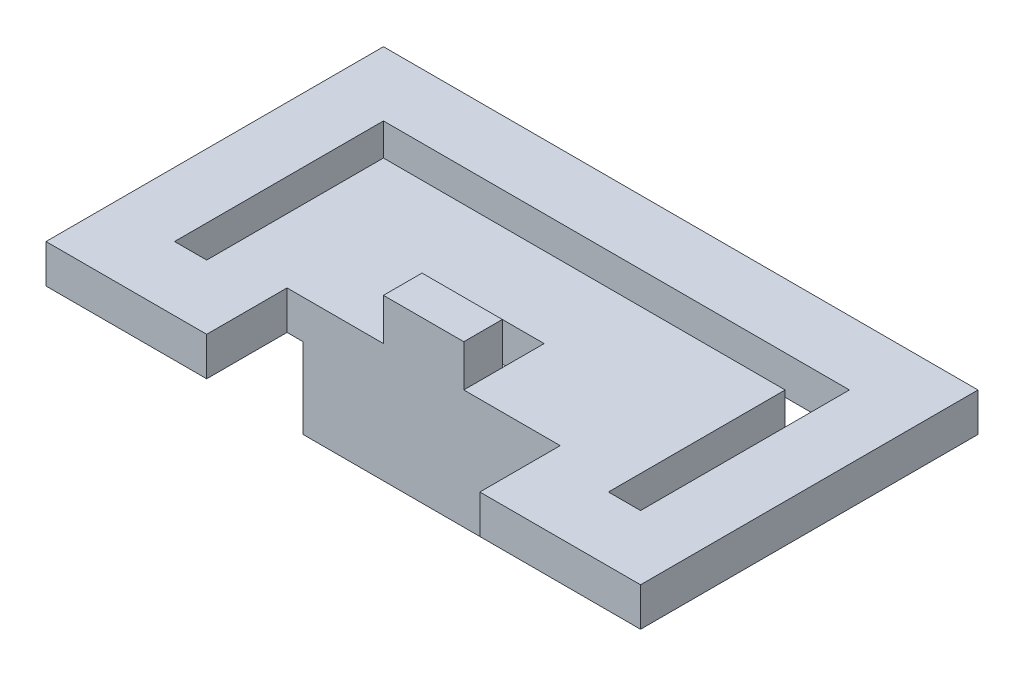
ISO-10303-21;
HEADER;
FILE_DESCRIPTION(('STEP AP214'),'2;1');
FILE_NAME('part.step','',(''),(''),'','','');
FILE_SCHEMA(('AUTOMOTIVE_DESIGN { 1 0 10303 214 1 1 1 1 }'));
ENDSEC;
DATA;
#1=APPLICATION_CONTEXT('core data for automotive mechanical design processes');
#2=APPLICATION_PROTOCOL_DEFINITION('international standard','automotive_design',2000,#1);
#3=PRODUCT_CONTEXT('',#1,'mechanical');
#4=PRODUCT('Part','Part','',(#3));
#5=PRODUCT_RELATED_PRODUCT_CATEGORY('part','',(#4));
#6=PRODUCT_DEFINITION_FORMATION('','',#4);
#7=PRODUCT_DEFINITION_CONTEXT('part definition',#1,'design');
#8=PRODUCT_DEFINITION('design','',#6,#7);
#9=PRODUCT_DEFINITION_SHAPE('','',#8);
#10=(LENGTH_UNIT() NAMED_UNIT(*) SI_UNIT(.MILLI.,.METRE.));
#11=(NAMED_UNIT(*) PLANE_ANGLE_UNIT() SI_UNIT($,.RADIAN.));
#12=(NAMED_UNIT(*) SI_UNIT($,.STERADIAN.) SOLID_ANGLE_UNIT());
#13=UNCERTAINTY_MEASURE_WITH_UNIT(LENGTH_MEASURE(1.E-05),#10,'distance_accuracy_value','');
#14=(GEOMETRIC_REPRESENTATION_CONTEXT(3) GLOBAL_UNCERTAINTY_ASSIGNED_CONTEXT((#13)) GLOBAL_UNIT_ASSIGNED_CONTEXT((#10,
#11,#12)) REPRESENTATION_CONTEXT('',''));
#15=CARTESIAN_POINT('',(0.,0.,0.));
#16=DIRECTION('',(0.,0.,1.));
#17=DIRECTION('',(1.,0.,0.));
#18=AXIS2_PLACEMENT_3D('',#15,#16,#17);
#19=CARTESIAN_POINT('',(1.5,0.,0.24));
#20=DIRECTION('',(0.,1.,0.));
#21=DIRECTION('',(0.,0.,1.));
#22=AXIS2_PLACEMENT_3D('',#19,#20,#21);
#23=PLANE('',#22);
#24=DIRECTION('',(1.,0.,0.));
#25=VECTOR('',#24,1.);
#26=CARTESIAN_POINT('',(1.5,0.,0.));
#27=LINE('',#26,#25);
#28=CARTESIAN_POINT('',(0.,0.,0.));
#29=VERTEX_POINT('',#28);
#30=CARTESIAN_POINT('',(1.5,0.,0.));
#31=VERTEX_POINT('',#30);
#32=EDGE_CURVE('E438',#29,#31,#27,.T.);
#33=ORIENTED_EDGE('',*,*,#32,.T.);
#34=DIRECTION('',(0.,0.,-1.));
#35=VECTOR('',#34,1.);
#36=CARTESIAN_POINT('',(1.5,0.,0.24));
#37=LINE('',#36,#35);
#38=CARTESIAN_POINT('',(1.5,0.,0.24));
#39=VERTEX_POINT('',#38);
#40=EDGE_CURVE('E11',#39,#31,#37,.T.);
#41=ORIENTED_EDGE('',*,*,#40,.F.);
#42=DIRECTION('',(1.,0.,0.));
#43=VECTOR('',#42,1.);
#44=CARTESIAN_POINT('',(1.5,0.,0.24));
#45=LINE('',#44,#43);
#46=CARTESIAN_POINT('',(0.,0.,0.24));
#47=VERTEX_POINT('',#46);
#48=EDGE_CURVE('E439',#47,#39,#45,.T.);
#49=ORIENTED_EDGE('',*,*,#48,.F.);
#50=DIRECTION('',(0.,0.,-1.));
#51=VECTOR('',#50,1.);
#52=CARTESIAN_POINT('',(0.,0.,0.24));
#53=LINE('',#52,#51);
#54=EDGE_CURVE('E460',#47,#29,#53,.T.);
#55=ORIENTED_EDGE('',*,*,#54,.T.);
#56=EDGE_LOOP('',(#33,#41,#49,#55));
#57=FACE_BOUND('',#56,.T.);
#58=ADVANCED_FACE('F39',(#57),#23,.F.);
#59=CARTESIAN_POINT('',(1.5,0.5,0.24));
#60=DIRECTION('',(-1.,0.,0.));
#61=DIRECTION('',(0.,0.,1.));
#62=AXIS2_PLACEMENT_3D('',#59,#60,#61);
#63=PLANE('',#62);
#64=DIRECTION('',(0.,1.,0.));
#65=VECTOR('',#64,1.);
#66=CARTESIAN_POINT('',(1.5,0.5,0.));
#67=LINE('',#66,#65);
#68=CARTESIAN_POINT('',(1.5,0.5,0.));
#69=VERTEX_POINT('',#68);
#70=EDGE_CURVE('E464',#31,#69,#67,.T.);
#71=ORIENTED_EDGE('',*,*,#70,.T.);
#72=DIRECTION('',(0.,0.,-1.));
#73=VECTOR('',#72,1.);
#74=CARTESIAN_POINT('',(1.5,0.5,0.24));
#75=LINE('',#74,#73);
#76=CARTESIAN_POINT('',(1.5,0.5,0.24));
#77=VERTEX_POINT('',#76);
#78=EDGE_CURVE('E47',#77,#69,#75,.T.);
#79=ORIENTED_EDGE('',*,*,#78,.F.);
#80=DIRECTION('',(0.,1.,0.));
#81=VECTOR('',#80,1.);
#82=CARTESIAN_POINT('',(1.5,0.5,0.24));
#83=LINE('',#82,#81);
#84=EDGE_CURVE('E443',#39,#77,#83,.T.);
#85=ORIENTED_EDGE('',*,*,#84,.F.);
#86=ORIENTED_EDGE('',*,*,#40,.T.);
#87=EDGE_LOOP('',(#71,#79,#85,#86));
#88=FACE_BOUND('',#87,.T.);
#89=ADVANCED_FACE('F514',(#88),#63,.F.);
#90=CARTESIAN_POINT('',(1.,1.,0.24));
#91=DIRECTION('',(-1.,0.,0.));
#92=DIRECTION('',(0.,0.,1.));
#93=AXIS2_PLACEMENT_3D('',#90,#91,#92);
#94=PLANE('',#93);
#95=DIRECTION('',(0.,1.,0.));
#96=VECTOR('',#95,1.);
#97=CARTESIAN_POINT('',(1.,1.,0.24));
#98=LINE('',#97,#96);
#99=CARTESIAN_POINT('',(1.,0.74,0.24));
#100=VERTEX_POINT('',#99);
#101=CARTESIAN_POINT('',(1.,1.,0.24));
#102=VERTEX_POINT('',#101);
#103=EDGE_CURVE('E447',#100,#102,#98,.T.);
#104=ORIENTED_EDGE('',*,*,#103,.F.);
#105=DIRECTION('',(0.,0.,1.));
#106=VECTOR('',#105,1.);
#107=CARTESIAN_POINT('',(1.,0.74,-0.26));
#108=LINE('',#107,#106);
#109=CARTESIAN_POINT('',(1.,0.74,0.));
#110=VERTEX_POINT('',#109);
#111=EDGE_CURVE('E385',#110,#100,#108,.T.);
#112=ORIENTED_EDGE('',*,*,#111,.F.);
#113=DIRECTION('',(0.,1.,0.));
#114=VECTOR('',#113,1.);
#115=CARTESIAN_POINT('',(1.,1.,0.));
#116=LINE('',#115,#114);
#117=CARTESIAN_POINT('',(1.,1.,0.));
#118=VERTEX_POINT('',#117);
#119=EDGE_CURVE('E471',#110,#118,#116,.T.);
#120=ORIENTED_EDGE('',*,*,#119,.T.);
#121=DIRECTION('',(0.,0.,-1.));
#122=VECTOR('',#121,1.);
#123=CARTESIAN_POINT('',(1.,1.,0.24));
#124=LINE('',#123,#122);
#125=EDGE_CURVE('E501',#102,#118,#124,.T.);
#126=ORIENTED_EDGE('',*,*,#125,.F.);
#127=EDGE_LOOP('',(#104,#112,#120,#126));
#128=FACE_BOUND('',#127,.T.);
#129=ADVANCED_FACE('F547',(#128),#94,.F.);
#130=CARTESIAN_POINT('',(0.5,1.,0.24));
#131=DIRECTION('',(0.,-1.,0.));
#132=DIRECTION('',(0.,0.,-1.));
#133=AXIS2_PLACEMENT_3D('',#130,#131,#132);
#134=PLANE('',#133);
#135=DIRECTION('',(-1.,0.,0.));
#136=VECTOR('',#135,1.);
#137=CARTESIAN_POINT('',(0.5,1.,0.));
#138=LINE('',#137,#136);
#139=CARTESIAN_POINT('',(0.5,1.,0.));
#140=VERTEX_POINT('',#139);
#141=EDGE_CURVE('E476',#118,#140,#138,.T.);
#142=ORIENTED_EDGE('',*,*,#141,.T.);
#143=DIRECTION('',(0.,0.,-1.));
#144=VECTOR('',#143,1.);
#145=CARTESIAN_POINT('',(0.5,1.,0.24));
#146=LINE('',#145,#144);
#147=CARTESIAN_POINT('',(0.5,1.,0.24));
#148=VERTEX_POINT('',#147);
#149=EDGE_CURVE('E497',#148,#140,#146,.T.);
#150=ORIENTED_EDGE('',*,*,#149,.F.);
#151=DIRECTION('',(-1.,0.,0.));
#152=VECTOR('',#151,1.);
#153=CARTESIAN_POINT('',(0.5,1.,0.24));
#154=LINE('',#153,#152);
#155=EDGE_CURVE('E450',#102,#148,#154,.T.);
#156=ORIENTED_EDGE('',*,*,#155,.F.);
#157=ORIENTED_EDGE('',*,*,#125,.T.);
#158=EDGE_LOOP('',(#142,#150,#156,#157));
#159=FACE_BOUND('',#158,.T.);
#160=ADVANCED_FACE('F550',(#159),#134,.F.);
#161=CARTESIAN_POINT('',(0.5,0.5,0.24));
#162=DIRECTION('',(1.,0.,0.));
#163=DIRECTION('',(0.,0.,-1.));
#164=AXIS2_PLACEMENT_3D('',#161,#162,#163);
#165=PLANE('',#164);
#166=DIRECTION('',(0.,-1.,0.));
#167=VECTOR('',#166,1.);
#168=CARTESIAN_POINT('',(0.5,0.5,0.));
#169=LINE('',#168,#167);
#170=CARTESIAN_POINT('',(0.5,0.74,0.));
#171=VERTEX_POINT('',#170);
#172=EDGE_CURVE('E480',#140,#171,#169,.T.);
#173=ORIENTED_EDGE('',*,*,#172,.T.);
#174=DIRECTION('',(0.,0.,-1.));
#175=VECTOR('',#174,1.);
#176=CARTESIAN_POINT('',(0.5,0.74,0.24));
#177=LINE('',#176,#175);
#178=CARTESIAN_POINT('',(0.5,0.74,0.24));
#179=VERTEX_POINT('',#178);
#180=EDGE_CURVE('E379',#179,#171,#177,.T.);
#181=ORIENTED_EDGE('',*,*,#180,.F.);
#182=DIRECTION('',(0.,-1.,0.));
#183=VECTOR('',#182,1.);
#184=CARTESIAN_POINT('',(0.5,0.5,0.24));
#185=LINE('',#184,#183);
#186=EDGE_CURVE('E453',#148,#179,#185,.T.);
#187=ORIENTED_EDGE('',*,*,#186,.F.);
#188=ORIENTED_EDGE('',*,*,#149,.T.);
#189=EDGE_LOOP('',(#173,#181,#187,#188));
#190=FACE_BOUND('',#189,.T.);
#191=ADVANCED_FACE('F553',(#190),#165,.F.);
#192=CARTESIAN_POINT('',(0.,0.,0.24));
#193=DIRECTION('',(1.,0.,0.));
#194=DIRECTION('',(0.,0.,-1.));
#195=AXIS2_PLACEMENT_3D('',#192,#193,#194);
#196=PLANE('',#195);
#197=DIRECTION('',(0.,-1.,0.));
#198=VECTOR('',#197,1.);
#199=CARTESIAN_POINT('',(0.,0.,0.));
#200=LINE('',#199,#198);
#201=CARTESIAN_POINT('',(0.,0.5,0.));
#202=VERTEX_POINT('',#201);
#203=EDGE_CURVE('E444',#202,#29,#200,.T.);
#204=ORIENTED_EDGE('',*,*,#203,.T.);
#205=ORIENTED_EDGE('',*,*,#54,.F.);
#206=DIRECTION('',(0.,-1.,0.));
#207=VECTOR('',#206,1.);
#208=CARTESIAN_POINT('',(0.,0.,0.24));
#209=LINE('',#208,#207);
#210=CARTESIAN_POINT('',(0.,0.5,0.24));
#211=VERTEX_POINT('',#210);
#212=EDGE_CURVE('E457',#211,#47,#209,.T.);
#213=ORIENTED_EDGE('',*,*,#212,.F.);
#214=DIRECTION('',(0.,0.,-1.));
#215=VECTOR('',#214,1.);
#216=CARTESIAN_POINT('',(0.,0.5,0.24));
#217=LINE('',#216,#215);
#218=EDGE_CURVE('E493',#211,#202,#217,.T.);
#219=ORIENTED_EDGE('',*,*,#218,.T.);
#220=EDGE_LOOP('',(#204,#205,#213,#219));
#221=FACE_BOUND('',#220,.T.);
#222=ADVANCED_FACE('F585',(#221),#196,.F.);
#223=CARTESIAN_POINT('',(0.,0.,0.24));
#224=DIRECTION('',(0.,0.,-1.));
#225=DIRECTION('',(-1.,0.,0.));
#226=AXIS2_PLACEMENT_3D('',#223,#224,#225);
#227=PLANE('',#226);
#228=DIRECTION('',(1.,0.,0.));
#229=VECTOR('',#228,1.);
#230=CARTESIAN_POINT('',(-0.5,0.74,0.24));
#231=LINE('',#230,#229);
#232=CARTESIAN_POINT('',(-0.1,0.74,0.24));
#233=VERTEX_POINT('',#232);
#234=EDGE_CURVE('E59',#233,#179,#231,.T.);
#235=ORIENTED_EDGE('',*,*,#234,.F.);
#236=DIRECTION('',(0.,1.,0.));
#237=VECTOR('',#236,1.);
#238=CARTESIAN_POINT('',(-0.1,0.5,0.24));
#239=LINE('',#238,#237);
#240=CARTESIAN_POINT('',(-0.1,0.5,0.24));
#241=VERTEX_POINT('',#240);
#242=EDGE_CURVE('E335',#241,#233,#239,.T.);
#243=ORIENTED_EDGE('',*,*,#242,.F.);
#244=DIRECTION('',(1.,0.,0.));
#245=VECTOR('',#244,1.);
#246=CARTESIAN_POINT('',(-0.5,0.5,0.24));
#247=LINE('',#246,#245);
#248=EDGE_CURVE('E338',#241,#211,#247,.T.);
#249=ORIENTED_EDGE('',*,*,#248,.T.);
#250=ORIENTED_EDGE('',*,*,#212,.T.);
#251=ORIENTED_EDGE('',*,*,#48,.T.);
#252=ORIENTED_EDGE('',*,*,#84,.T.);
#253=DIRECTION('',(1.,0.,0.));
#254=VECTOR('',#253,1.);
#255=CARTESIAN_POINT('',(1.,0.5,0.24));
#256=LINE('',#255,#254);
#257=CARTESIAN_POINT('',(1.6,0.5,0.24));
#258=VERTEX_POINT('',#257);
#259=EDGE_CURVE('E415',#77,#258,#256,.T.);
#260=ORIENTED_EDGE('',*,*,#259,.T.);
#261=DIRECTION('',(0.,1.,0.));
#262=VECTOR('',#261,1.);
#263=CARTESIAN_POINT('',(1.6,0.5,0.24));
#264=LINE('',#263,#262);
#265=CARTESIAN_POINT('',(1.6,0.74,0.24));
#266=VERTEX_POINT('',#265);
#267=EDGE_CURVE('E357',#258,#266,#264,.T.);
#268=ORIENTED_EDGE('',*,*,#267,.T.);
#269=DIRECTION('',(1.,0.,0.));
#270=VECTOR('',#269,1.);
#271=CARTESIAN_POINT('',(1.,0.74,0.24));
#272=LINE('',#271,#270);
#273=EDGE_CURVE('E390',#100,#266,#272,.T.);
#274=ORIENTED_EDGE('',*,*,#273,.F.);
#275=ORIENTED_EDGE('',*,*,#103,.T.);
#276=ORIENTED_EDGE('',*,*,#155,.T.);
#277=ORIENTED_EDGE('',*,*,#186,.T.);
#278=EDGE_LOOP('',(#235,#243,#249,#250,#251,#252,#260,#268,#274,#275,#276,#277));
#279=FACE_BOUND('',#278,.T.);
#280=ADVANCED_FACE('F556',(#279),#227,.F.);
#281=CARTESIAN_POINT('',(0.,0.,0.));
#282=DIRECTION('',(0.,0.,-1.));
#283=DIRECTION('',(-1.,0.,0.));
#284=AXIS2_PLACEMENT_3D('',#281,#282,#283);
#285=PLANE('',#284);
#286=ORIENTED_EDGE('',*,*,#32,.F.);
#287=ORIENTED_EDGE('',*,*,#203,.F.);
#288=DIRECTION('',(-1.,0.,0.));
#289=VECTOR('',#288,1.);
#290=CARTESIAN_POINT('',(0.,0.5,0.));
#291=LINE('',#290,#289);
#292=CARTESIAN_POINT('',(0.5,0.5,0.));
#293=VERTEX_POINT('',#292);
#294=EDGE_CURVE('E484',#293,#202,#291,.T.);
#295=ORIENTED_EDGE('',*,*,#294,.F.);
#296=EDGE_CURVE('E479',#171,#293,#169,.T.);
#297=ORIENTED_EDGE('',*,*,#296,.F.);
#298=ORIENTED_EDGE('',*,*,#172,.F.);
#299=ORIENTED_EDGE('',*,*,#141,.F.);
#300=ORIENTED_EDGE('',*,*,#119,.F.);
#301=CARTESIAN_POINT('',(1.,0.5,0.));
#302=VERTEX_POINT('',#301);
#303=EDGE_CURVE('E472',#302,#110,#116,.T.);
#304=ORIENTED_EDGE('',*,*,#303,.F.);
#305=DIRECTION('',(-1.,0.,0.));
#306=VECTOR('',#305,1.);
#307=CARTESIAN_POINT('',(1.,0.5,0.));
#308=LINE('',#307,#306);
#309=EDGE_CURVE('E467',#69,#302,#308,.T.);
#310=ORIENTED_EDGE('',*,*,#309,.F.);
#311=ORIENTED_EDGE('',*,*,#70,.F.);
#312=EDGE_LOOP('',(#286,#287,#295,#297,#298,#299,#300,#304,#310,#311));
#313=FACE_BOUND('',#312,.T.);
#314=ADVANCED_FACE('F518',(#313),#285,.T.);
#315=CARTESIAN_POINT('',(0.,0.5,0.));
#316=DIRECTION('',(0.,1.,0.));
#317=DIRECTION('',(0.,0.,1.));
#318=AXIS2_PLACEMENT_3D('',#315,#316,#317);
#319=PLANE('',#318);
#320=ORIENTED_EDGE('',*,*,#248,.F.);
#321=DIRECTION('',(0.,0.,-1.));
#322=VECTOR('',#321,1.);
#323=CARTESIAN_POINT('',(-0.1,0.5,0.24));
#324=LINE('',#323,#322);
#325=CARTESIAN_POINT('',(-0.0999999999999999,0.5,0.74));
#326=VERTEX_POINT('',#325);
#327=EDGE_CURVE('E242',#326,#241,#324,.T.);
#328=ORIENTED_EDGE('',*,*,#327,.F.);
#329=DIRECTION('',(1.,0.,0.));
#330=VECTOR('',#329,1.);
#331=CARTESIAN_POINT('',(-0.0999999999999999,0.5,0.74));
#332=LINE('',#331,#330);
#333=CARTESIAN_POINT('',(-1.1,0.5,0.74));
#334=VERTEX_POINT('',#333);
#335=EDGE_CURVE('E289',#334,#326,#332,.T.);
#336=ORIENTED_EDGE('',*,*,#335,.F.);
#337=DIRECTION('',(0.,0.,1.));
#338=VECTOR('',#337,1.);
#339=CARTESIAN_POINT('',(-1.1,0.5,0.74));
#340=LINE('',#339,#338);
#341=CARTESIAN_POINT('',(-1.1,0.5,-1.36));
#342=VERTEX_POINT('',#341);
#343=EDGE_CURVE('E285',#342,#334,#340,.T.);
#344=ORIENTED_EDGE('',*,*,#343,.F.);
#345=DIRECTION('',(-1.,0.,0.));
#346=VECTOR('',#345,1.);
#347=CARTESIAN_POINT('',(-1.1,0.5,-1.36));
#348=LINE('',#347,#346);
#349=CARTESIAN_POINT('',(2.6,0.5,-1.36));
#350=VERTEX_POINT('',#349);
#351=EDGE_CURVE('E281',#350,#342,#348,.T.);
#352=ORIENTED_EDGE('',*,*,#351,.F.);
#353=DIRECTION('',(0.,0.,-1.));
#354=VECTOR('',#353,1.);
#355=CARTESIAN_POINT('',(2.6,0.5,-1.36));
#356=LINE('',#355,#354);
#357=CARTESIAN_POINT('',(2.6,0.5,0.74));
#358=VERTEX_POINT('',#357);
#359=EDGE_CURVE('E277',#358,#350,#356,.T.);
#360=ORIENTED_EDGE('',*,*,#359,.F.);
#361=DIRECTION('',(1.,0.,0.));
#362=VECTOR('',#361,1.);
#363=CARTESIAN_POINT('',(2.6,0.5,0.74));
#364=LINE('',#363,#362);
#365=CARTESIAN_POINT('',(1.6,0.5,0.74));
#366=VERTEX_POINT('',#365);
#367=EDGE_CURVE('E273',#366,#358,#364,.T.);
#368=ORIENTED_EDGE('',*,*,#367,.F.);
#369=DIRECTION('',(0.,0.,1.));
#370=VECTOR('',#369,1.);
#371=CARTESIAN_POINT('',(1.6,0.5,0.74));
#372=LINE('',#371,#370);
#373=EDGE_CURVE('E269',#258,#366,#372,.T.);
#374=ORIENTED_EDGE('',*,*,#373,.F.);
#375=ORIENTED_EDGE('',*,*,#259,.F.);
#376=ORIENTED_EDGE('',*,*,#78,.T.);
#377=ORIENTED_EDGE('',*,*,#309,.T.);
#378=DIRECTION('',(0.,0.,1.));
#379=VECTOR('',#378,1.);
#380=CARTESIAN_POINT('',(1.,0.5,-0.26));
#381=LINE('',#380,#379);
#382=CARTESIAN_POINT('',(1.,0.5,-0.26));
#383=VERTEX_POINT('',#382);
#384=EDGE_CURVE('E411',#383,#302,#381,.T.);
#385=ORIENTED_EDGE('',*,*,#384,.F.);
#386=DIRECTION('',(1.,0.,0.));
#387=VECTOR('',#386,1.);
#388=CARTESIAN_POINT('',(0.5,0.5,-0.26));
#389=LINE('',#388,#387);
#390=CARTESIAN_POINT('',(0.5,0.5,-0.26));
#391=VERTEX_POINT('',#390);
#392=EDGE_CURVE('E408',#391,#383,#389,.T.);
#393=ORIENTED_EDGE('',*,*,#392,.F.);
#394=DIRECTION('',(0.,0.,-1.));
#395=VECTOR('',#394,1.);
#396=CARTESIAN_POINT('',(0.5,0.5,0.24));
#397=LINE('',#396,#395);
#398=EDGE_CURVE('E405',#293,#391,#397,.T.);
#399=ORIENTED_EDGE('',*,*,#398,.F.);
#400=ORIENTED_EDGE('',*,*,#294,.T.);
#401=ORIENTED_EDGE('',*,*,#218,.F.);
#402=EDGE_LOOP('',(#320,#328,#336,#344,#352,#360,#368,#374,#375,#376,#377,#385,#393,#399,#400,#401));
#403=FACE_BOUND('',#402,.T.);
#404=DIRECTION('',(-1.,0.,0.));
#405=VECTOR('',#404,1.);
#406=CARTESIAN_POINT('',(-0.7,0.5,0.34));
#407=LINE('',#406,#405);
#408=CARTESIAN_POINT('',(-0.5,0.5,0.34));
#409=VERTEX_POINT('',#408);
#410=CARTESIAN_POINT('',(-0.7,0.5,0.34));
#411=VERTEX_POINT('',#410);
#412=EDGE_CURVE('E237',#409,#411,#407,.T.);
#413=ORIENTED_EDGE('',*,*,#412,.F.);
#414=DIRECTION('',(0.,0.,1.));
#415=VECTOR('',#414,1.);
#416=CARTESIAN_POINT('',(-0.5,0.5,-0.76));
#417=LINE('',#416,#415);
#418=CARTESIAN_POINT('',(-0.5,0.5,-0.76));
#419=VERTEX_POINT('',#418);
#420=EDGE_CURVE('E220',#419,#409,#417,.T.);
#421=ORIENTED_EDGE('',*,*,#420,.F.);
#422=DIRECTION('',(-1.,0.,0.));
#423=VECTOR('',#422,1.);
#424=CARTESIAN_POINT('',(2.,0.5,-0.76));
#425=LINE('',#424,#423);
#426=CARTESIAN_POINT('',(2.,0.5,-0.76));
#427=VERTEX_POINT('',#426);
#428=EDGE_CURVE('E232',#427,#419,#425,.T.);
#429=ORIENTED_EDGE('',*,*,#428,.F.);
#430=DIRECTION('',(0.,0.,-1.));
#431=VECTOR('',#430,1.);
#432=CARTESIAN_POINT('',(2.,0.5,0.24));
#433=LINE('',#432,#431);
#434=CARTESIAN_POINT('',(2.,0.5,0.34));
#435=VERTEX_POINT('',#434);
#436=EDGE_CURVE('E419',#435,#427,#433,.T.);
#437=ORIENTED_EDGE('',*,*,#436,.F.);
#438=DIRECTION('',(-1.,0.,0.));
#439=VECTOR('',#438,1.);
#440=CARTESIAN_POINT('',(2.,0.5,0.34));
#441=LINE('',#440,#439);
#442=CARTESIAN_POINT('',(2.2,0.5,0.34));
#443=VERTEX_POINT('',#442);
#444=EDGE_CURVE('E265',#443,#435,#441,.T.);
#445=ORIENTED_EDGE('',*,*,#444,.F.);
#446=DIRECTION('',(0.,0.,1.));
#447=VECTOR('',#446,1.);
#448=CARTESIAN_POINT('',(2.2,0.5,0.34));
#449=LINE('',#448,#447);
#450=CARTESIAN_POINT('',(2.2,0.5,-0.96));
#451=VERTEX_POINT('',#450);
#452=EDGE_CURVE('E261',#451,#443,#449,.T.);
#453=ORIENTED_EDGE('',*,*,#452,.F.);
#454=DIRECTION('',(1.,0.,0.));
#455=VECTOR('',#454,1.);
#456=CARTESIAN_POINT('',(2.2,0.5,-0.96));
#457=LINE('',#456,#455);
#458=CARTESIAN_POINT('',(-0.7,0.5,-0.96));
#459=VERTEX_POINT('',#458);
#460=EDGE_CURVE('E253',#459,#451,#457,.T.);
#461=ORIENTED_EDGE('',*,*,#460,.F.);
#462=DIRECTION('',(0.,0.,-1.));
#463=VECTOR('',#462,1.);
#464=CARTESIAN_POINT('',(-0.7,0.5,-0.96));
#465=LINE('',#464,#463);
#466=EDGE_CURVE('E248',#411,#459,#465,.T.);
#467=ORIENTED_EDGE('',*,*,#466,.F.);
#468=EDGE_LOOP('',(#413,#421,#429,#437,#445,#453,#461,#467));
#469=FACE_BOUND('',#468,.T.);
#470=ADVANCED_FACE('F245',(#403,#469),#319,.F.);
#471=CARTESIAN_POINT('',(0.5,0.74,0.24));
#472=DIRECTION('',(-1.,0.,0.));
#473=DIRECTION('',(0.,0.,1.));
#474=AXIS2_PLACEMENT_3D('',#471,#472,#473);
#475=PLANE('',#474);
#476=ORIENTED_EDGE('',*,*,#296,.T.);
#477=ORIENTED_EDGE('',*,*,#398,.T.);
#478=DIRECTION('',(0.,-1.,0.));
#479=VECTOR('',#478,1.);
#480=CARTESIAN_POINT('',(0.5,0.74,-0.26));
#481=LINE('',#480,#479);
#482=CARTESIAN_POINT('',(0.5,0.74,-0.26));
#483=VERTEX_POINT('',#482);
#484=EDGE_CURVE('E434',#483,#391,#481,.T.);
#485=ORIENTED_EDGE('',*,*,#484,.F.);
#486=EDGE_CURVE('E378',#171,#483,#177,.T.);
#487=ORIENTED_EDGE('',*,*,#486,.F.);
#488=EDGE_LOOP('',(#476,#477,#485,#487));
#489=FACE_BOUND('',#488,.T.);
#490=ADVANCED_FACE('F539',(#489),#475,.F.);
#491=CARTESIAN_POINT('',(0.5,0.74,-0.26));
#492=DIRECTION('',(0.,0.,-1.));
#493=DIRECTION('',(-1.,0.,0.));
#494=AXIS2_PLACEMENT_3D('',#491,#492,#493);
#495=PLANE('',#494);
#496=ORIENTED_EDGE('',*,*,#392,.T.);
#497=DIRECTION('',(0.,-1.,0.));
#498=VECTOR('',#497,1.);
#499=CARTESIAN_POINT('',(1.,0.74,-0.26));
#500=LINE('',#499,#498);
#501=CARTESIAN_POINT('',(1.,0.74,-0.26));
#502=VERTEX_POINT('',#501);
#503=EDGE_CURVE('E430',#502,#383,#500,.T.);
#504=ORIENTED_EDGE('',*,*,#503,.F.);
#505=DIRECTION('',(1.,0.,0.));
#506=VECTOR('',#505,1.);
#507=CARTESIAN_POINT('',(0.5,0.74,-0.26));
#508=LINE('',#507,#506);
#509=EDGE_CURVE('E382',#483,#502,#508,.T.);
#510=ORIENTED_EDGE('',*,*,#509,.F.);
#511=ORIENTED_EDGE('',*,*,#484,.T.);
#512=EDGE_LOOP('',(#496,#504,#510,#511));
#513=FACE_BOUND('',#512,.T.);
#514=ADVANCED_FACE('F533',(#513),#495,.F.);
#515=CARTESIAN_POINT('',(1.,0.74,-0.26));
#516=DIRECTION('',(1.,0.,0.));
#517=DIRECTION('',(0.,0.,-1.));
#518=AXIS2_PLACEMENT_3D('',#515,#516,#517);
#519=PLANE('',#518);
#520=ORIENTED_EDGE('',*,*,#303,.T.);
#521=EDGE_CURVE('E386',#502,#110,#108,.T.);
#522=ORIENTED_EDGE('',*,*,#521,.F.);
#523=ORIENTED_EDGE('',*,*,#503,.T.);
#524=ORIENTED_EDGE('',*,*,#384,.T.);
#525=EDGE_LOOP('',(#520,#522,#523,#524));
#526=FACE_BOUND('',#525,.T.);
#527=ADVANCED_FACE('F523',(#526),#519,.F.);
#528=CARTESIAN_POINT('',(2.,0.74,0.24));
#529=DIRECTION('',(-1.,0.,0.));
#530=DIRECTION('',(0.,0.,1.));
#531=AXIS2_PLACEMENT_3D('',#528,#529,#530);
#532=PLANE('',#531);
#533=ORIENTED_EDGE('',*,*,#436,.T.);
#534=DIRECTION('',(0.,-1.,0.));
#535=VECTOR('',#534,1.);
#536=CARTESIAN_POINT('',(2.,0.74,-0.76));
#537=LINE('',#536,#535);
#538=CARTESIAN_POINT('',(2.,0.74,-0.76));
#539=VERTEX_POINT('',#538);
#540=EDGE_CURVE('E426',#539,#427,#537,.T.);
#541=ORIENTED_EDGE('',*,*,#540,.F.);
#542=DIRECTION('',(0.,0.,-1.));
#543=VECTOR('',#542,1.);
#544=CARTESIAN_POINT('',(2.,0.74,0.24));
#545=LINE('',#544,#543);
#546=CARTESIAN_POINT('',(2.,0.74,0.34));
#547=VERTEX_POINT('',#546);
#548=EDGE_CURVE('E394',#547,#539,#545,.T.);
#549=ORIENTED_EDGE('',*,*,#548,.F.);
#550=DIRECTION('',(0.,1.,0.));
#551=VECTOR('',#550,1.);
#552=CARTESIAN_POINT('',(2.,0.5,0.34));
#553=LINE('',#552,#551);
#554=EDGE_CURVE('E361',#435,#547,#553,.T.);
#555=ORIENTED_EDGE('',*,*,#554,.F.);
#556=EDGE_LOOP('',(#533,#541,#549,#555));
#557=FACE_BOUND('',#556,.T.);
#558=ADVANCED_FACE('F614',(#557),#532,.F.);
#559=CARTESIAN_POINT('',(2.,0.74,-0.76));
#560=DIRECTION('',(0.,0.,1.));
#561=DIRECTION('',(1.,0.,0.));
#562=AXIS2_PLACEMENT_3D('',#559,#560,#561);
#563=PLANE('',#562);
#564=ORIENTED_EDGE('',*,*,#428,.T.);
#565=DIRECTION('',(0.,-1.,0.));
#566=VECTOR('',#565,1.);
#567=CARTESIAN_POINT('',(-0.5,0.74,-0.76));
#568=LINE('',#567,#566);
#569=CARTESIAN_POINT('',(-0.5,0.74,-0.76));
#570=VERTEX_POINT('',#569);
#571=EDGE_CURVE('E227',#570,#419,#568,.T.);
#572=ORIENTED_EDGE('',*,*,#571,.F.);
#573=DIRECTION('',(-1.,0.,0.));
#574=VECTOR('',#573,1.);
#575=CARTESIAN_POINT('',(2.,0.74,-0.76));
#576=LINE('',#575,#574);
#577=EDGE_CURVE('E397',#539,#570,#576,.T.);
#578=ORIENTED_EDGE('',*,*,#577,.F.);
#579=ORIENTED_EDGE('',*,*,#540,.T.);
#580=EDGE_LOOP('',(#564,#572,#578,#579));
#581=FACE_BOUND('',#580,.T.);
#582=ADVANCED_FACE('F617',(#581),#563,.F.);
#583=CARTESIAN_POINT('',(-0.5,0.74,-0.76));
#584=DIRECTION('',(1.,0.,0.));
#585=DIRECTION('',(0.,0.,-1.));
#586=AXIS2_PLACEMENT_3D('',#583,#584,#585);
#587=PLANE('',#586);
#588=ORIENTED_EDGE('',*,*,#420,.T.);
#589=DIRECTION('',(0.,1.,0.));
#590=VECTOR('',#589,1.);
#591=CARTESIAN_POINT('',(-0.5,0.5,0.34));
#592=LINE('',#591,#590);
#593=CARTESIAN_POINT('',(-0.5,0.74,0.34));
#594=VERTEX_POINT('',#593);
#595=EDGE_CURVE('E224',#409,#594,#592,.T.);
#596=ORIENTED_EDGE('',*,*,#595,.T.);
#597=DIRECTION('',(0.,0.,1.));
#598=VECTOR('',#597,1.);
#599=CARTESIAN_POINT('',(-0.5,0.74,-0.76));
#600=LINE('',#599,#598);
#601=EDGE_CURVE('E400',#570,#594,#600,.T.);
#602=ORIENTED_EDGE('',*,*,#601,.F.);
#603=ORIENTED_EDGE('',*,*,#571,.T.);
#604=EDGE_LOOP('',(#588,#596,#602,#603));
#605=FACE_BOUND('',#604,.T.);
#606=ADVANCED_FACE('F222',(#605),#587,.F.);
#607=CARTESIAN_POINT('',(0.,0.74,0.));
#608=DIRECTION('',(0.,1.,0.));
#609=DIRECTION('',(0.,0.,1.));
#610=AXIS2_PLACEMENT_3D('',#607,#608,#609);
#611=PLANE('',#610);
#612=DIRECTION('',(0.,0.,-1.));
#613=VECTOR('',#612,1.);
#614=CARTESIAN_POINT('',(-0.1,0.74,0.24));
#615=LINE('',#614,#613);
#616=CARTESIAN_POINT('',(-0.0999999999999999,0.74,0.74));
#617=VERTEX_POINT('',#616);
#618=EDGE_CURVE('E54',#617,#233,#615,.T.);
#619=ORIENTED_EDGE('',*,*,#618,.T.);
#620=ORIENTED_EDGE('',*,*,#234,.T.);
#621=ORIENTED_EDGE('',*,*,#180,.T.);
#622=ORIENTED_EDGE('',*,*,#486,.T.);
#623=ORIENTED_EDGE('',*,*,#509,.T.);
#624=ORIENTED_EDGE('',*,*,#521,.T.);
#625=ORIENTED_EDGE('',*,*,#111,.T.);
#626=ORIENTED_EDGE('',*,*,#273,.T.);
#627=DIRECTION('',(0.,0.,1.));
#628=VECTOR('',#627,1.);
#629=CARTESIAN_POINT('',(1.6,0.74,0.74));
#630=LINE('',#629,#628);
#631=CARTESIAN_POINT('',(1.6,0.74,0.74));
#632=VERTEX_POINT('',#631);
#633=EDGE_CURVE('E313',#266,#632,#630,.T.);
#634=ORIENTED_EDGE('',*,*,#633,.T.);
#635=DIRECTION('',(1.,0.,0.));
#636=VECTOR('',#635,1.);
#637=CARTESIAN_POINT('',(2.6,0.74,0.74));
#638=LINE('',#637,#636);
#639=CARTESIAN_POINT('',(2.6,0.74,0.74));
#640=VERTEX_POINT('',#639);
#641=EDGE_CURVE('E317',#632,#640,#638,.T.);
#642=ORIENTED_EDGE('',*,*,#641,.T.);
#643=DIRECTION('',(0.,0.,-1.));
#644=VECTOR('',#643,1.);
#645=CARTESIAN_POINT('',(2.6,0.74,-1.36));
#646=LINE('',#645,#644);
#647=CARTESIAN_POINT('',(2.6,0.74,-1.36));
#648=VERTEX_POINT('',#647);
#649=EDGE_CURVE('E321',#640,#648,#646,.T.);
#650=ORIENTED_EDGE('',*,*,#649,.T.);
#651=DIRECTION('',(-1.,0.,0.));
#652=VECTOR('',#651,1.);
#653=CARTESIAN_POINT('',(-1.1,0.74,-1.36));
#654=LINE('',#653,#652);
#655=CARTESIAN_POINT('',(-1.1,0.74,-1.36));
#656=VERTEX_POINT('',#655);
#657=EDGE_CURVE('E325',#648,#656,#654,.T.);
#658=ORIENTED_EDGE('',*,*,#657,.T.);
#659=DIRECTION('',(0.,0.,1.));
#660=VECTOR('',#659,1.);
#661=CARTESIAN_POINT('',(-1.1,0.74,0.74));
#662=LINE('',#661,#660);
#663=CARTESIAN_POINT('',(-1.1,0.74,0.74));
#664=VERTEX_POINT('',#663);
#665=EDGE_CURVE('E329',#656,#664,#662,.T.);
#666=ORIENTED_EDGE('',*,*,#665,.T.);
#667=DIRECTION('',(1.,0.,0.));
#668=VECTOR('',#667,1.);
#669=CARTESIAN_POINT('',(-0.0999999999999999,0.74,0.74));
#670=LINE('',#669,#668);
#671=EDGE_CURVE('E255',#664,#617,#670,.T.);
#672=ORIENTED_EDGE('',*,*,#671,.T.);
#673=EDGE_LOOP('',(#619,#620,#621,#622,#623,#624,#625,#626,#634,#642,#650,#658,#666,#672));
#674=FACE_BOUND('',#673,.T.);
#675=ORIENTED_EDGE('',*,*,#601,.T.);
#676=DIRECTION('',(-1.,0.,0.));
#677=VECTOR('',#676,1.);
#678=CARTESIAN_POINT('',(-0.7,0.74,0.34));
#679=LINE('',#678,#677);
#680=CARTESIAN_POINT('',(-0.7,0.74,0.34));
#681=VERTEX_POINT('',#680);
#682=EDGE_CURVE('E239',#594,#681,#679,.T.);
#683=ORIENTED_EDGE('',*,*,#682,.T.);
#684=DIRECTION('',(0.,0.,-1.));
#685=VECTOR('',#684,1.);
#686=CARTESIAN_POINT('',(-0.7,0.74,-0.96));
#687=LINE('',#686,#685);
#688=CARTESIAN_POINT('',(-0.7,0.74,-0.96));
#689=VERTEX_POINT('',#688);
#690=EDGE_CURVE('E297',#681,#689,#687,.T.);
#691=ORIENTED_EDGE('',*,*,#690,.T.);
#692=DIRECTION('',(1.,0.,0.));
#693=VECTOR('',#692,1.);
#694=CARTESIAN_POINT('',(2.2,0.74,-0.96));
#695=LINE('',#694,#693);
#696=CARTESIAN_POINT('',(2.2,0.74,-0.96));
#697=VERTEX_POINT('',#696);
#698=EDGE_CURVE('E301',#689,#697,#695,.T.);
#699=ORIENTED_EDGE('',*,*,#698,.T.);
#700=DIRECTION('',(0.,0.,1.));
#701=VECTOR('',#700,1.);
#702=CARTESIAN_POINT('',(2.2,0.74,0.34));
#703=LINE('',#702,#701);
#704=CARTESIAN_POINT('',(2.2,0.74,0.34));
#705=VERTEX_POINT('',#704);
#706=EDGE_CURVE('E305',#697,#705,#703,.T.);
#707=ORIENTED_EDGE('',*,*,#706,.T.);
#708=DIRECTION('',(-1.,0.,0.));
#709=VECTOR('',#708,1.);
#710=CARTESIAN_POINT('',(2.,0.74,0.34));
#711=LINE('',#710,#709);
#712=EDGE_CURVE('E309',#705,#547,#711,.T.);
#713=ORIENTED_EDGE('',*,*,#712,.T.);
#714=ORIENTED_EDGE('',*,*,#548,.T.);
#715=ORIENTED_EDGE('',*,*,#577,.T.);
#716=EDGE_LOOP('',(#675,#683,#691,#699,#707,#713,#714,#715));
#717=FACE_BOUND('',#716,.T.);
#718=ADVANCED_FACE('F525',(#674,#717),#611,.T.);
#719=CARTESIAN_POINT('',(-0.1,0.5,0.24));
#720=DIRECTION('',(1.,0.,0.));
#721=DIRECTION('',(0.,0.,-1.));
#722=AXIS2_PLACEMENT_3D('',#719,#720,#721);
#723=PLANE('',#722);
#724=ORIENTED_EDGE('',*,*,#618,.F.);
#725=DIRECTION('',(0.,1.,0.));
#726=VECTOR('',#725,1.);
#727=CARTESIAN_POINT('',(-0.0999999999999999,0.5,0.74));
#728=LINE('',#727,#726);
#729=EDGE_CURVE('E339',#326,#617,#728,.T.);
#730=ORIENTED_EDGE('',*,*,#729,.F.);
#731=ORIENTED_EDGE('',*,*,#327,.T.);
#732=ORIENTED_EDGE('',*,*,#242,.T.);
#733=EDGE_LOOP('',(#724,#730,#731,#732));
#734=FACE_BOUND('',#733,.T.);
#735=ADVANCED_FACE('F581',(#734),#723,.T.);
#736=CARTESIAN_POINT('',(-0.0999999999999999,0.5,0.74));
#737=DIRECTION('',(0.,0.,1.));
#738=DIRECTION('',(1.,0.,0.));
#739=AXIS2_PLACEMENT_3D('',#736,#737,#738);
#740=PLANE('',#739);
#741=ORIENTED_EDGE('',*,*,#671,.F.);
#742=DIRECTION('',(0.,1.,0.));
#743=VECTOR('',#742,1.);
#744=CARTESIAN_POINT('',(-1.1,0.5,0.74));
#745=LINE('',#744,#743);
#746=EDGE_CURVE('E342',#334,#664,#745,.T.);
#747=ORIENTED_EDGE('',*,*,#746,.F.);
#748=ORIENTED_EDGE('',*,*,#335,.T.);
#749=ORIENTED_EDGE('',*,*,#729,.T.);
#750=EDGE_LOOP('',(#741,#747,#748,#749));
#751=FACE_BOUND('',#750,.T.);
#752=ADVANCED_FACE('F579',(#751),#740,.T.);
#753=CARTESIAN_POINT('',(-1.1,0.5,0.74));
#754=DIRECTION('',(-1.,0.,0.));
#755=DIRECTION('',(0.,0.,1.));
#756=AXIS2_PLACEMENT_3D('',#753,#754,#755);
#757=PLANE('',#756);
#758=ORIENTED_EDGE('',*,*,#665,.F.);
#759=DIRECTION('',(0.,1.,0.));
#760=VECTOR('',#759,1.);
#761=CARTESIAN_POINT('',(-1.1,0.5,-1.36));
#762=LINE('',#761,#760);
#763=EDGE_CURVE('E345',#342,#656,#762,.T.);
#764=ORIENTED_EDGE('',*,*,#763,.F.);
#765=ORIENTED_EDGE('',*,*,#343,.T.);
#766=ORIENTED_EDGE('',*,*,#746,.T.);
#767=EDGE_LOOP('',(#758,#764,#765,#766));
#768=FACE_BOUND('',#767,.T.);
#769=ADVANCED_FACE('F575',(#768),#757,.T.);
#770=CARTESIAN_POINT('',(-1.1,0.5,-1.36));
#771=DIRECTION('',(0.,0.,-1.));
#772=DIRECTION('',(-1.,0.,0.));
#773=AXIS2_PLACEMENT_3D('',#770,#771,#772);
#774=PLANE('',#773);
#775=ORIENTED_EDGE('',*,*,#657,.F.);
#776=DIRECTION('',(0.,1.,0.));
#777=VECTOR('',#776,1.);
#778=CARTESIAN_POINT('',(2.6,0.5,-1.36));
#779=LINE('',#778,#777);
#780=EDGE_CURVE('E348',#350,#648,#779,.T.);
#781=ORIENTED_EDGE('',*,*,#780,.F.);
#782=ORIENTED_EDGE('',*,*,#351,.T.);
#783=ORIENTED_EDGE('',*,*,#763,.T.);
#784=EDGE_LOOP('',(#775,#781,#782,#783));
#785=FACE_BOUND('',#784,.T.);
#786=ADVANCED_FACE('F571',(#785),#774,.T.);
#787=CARTESIAN_POINT('',(2.6,0.5,-1.36));
#788=DIRECTION('',(1.,0.,0.));
#789=DIRECTION('',(0.,0.,-1.));
#790=AXIS2_PLACEMENT_3D('',#787,#788,#789);
#791=PLANE('',#790);
#792=ORIENTED_EDGE('',*,*,#649,.F.);
#793=DIRECTION('',(0.,1.,0.));
#794=VECTOR('',#793,1.);
#795=CARTESIAN_POINT('',(2.6,0.5,0.74));
#796=LINE('',#795,#794);
#797=EDGE_CURVE('E351',#358,#640,#796,.T.);
#798=ORIENTED_EDGE('',*,*,#797,.F.);
#799=ORIENTED_EDGE('',*,*,#359,.T.);
#800=ORIENTED_EDGE('',*,*,#780,.T.);
#801=EDGE_LOOP('',(#792,#798,#799,#800));
#802=FACE_BOUND('',#801,.T.);
#803=ADVANCED_FACE('F567',(#802),#791,.T.);
#804=CARTESIAN_POINT('',(2.6,0.5,0.74));
#805=DIRECTION('',(0.,0.,1.));
#806=DIRECTION('',(1.,0.,0.));
#807=AXIS2_PLACEMENT_3D('',#804,#805,#806);
#808=PLANE('',#807);
#809=ORIENTED_EDGE('',*,*,#641,.F.);
#810=DIRECTION('',(0.,1.,0.));
#811=VECTOR('',#810,1.);
#812=CARTESIAN_POINT('',(1.6,0.5,0.74));
#813=LINE('',#812,#811);
#814=EDGE_CURVE('E354',#366,#632,#813,.T.);
#815=ORIENTED_EDGE('',*,*,#814,.F.);
#816=ORIENTED_EDGE('',*,*,#367,.T.);
#817=ORIENTED_EDGE('',*,*,#797,.T.);
#818=EDGE_LOOP('',(#809,#815,#816,#817));
#819=FACE_BOUND('',#818,.T.);
#820=ADVANCED_FACE('F563',(#819),#808,.T.);
#821=CARTESIAN_POINT('',(1.6,0.5,0.74));
#822=DIRECTION('',(-1.,0.,0.));
#823=DIRECTION('',(0.,0.,1.));
#824=AXIS2_PLACEMENT_3D('',#821,#822,#823);
#825=PLANE('',#824);
#826=ORIENTED_EDGE('',*,*,#633,.F.);
#827=ORIENTED_EDGE('',*,*,#267,.F.);
#828=ORIENTED_EDGE('',*,*,#373,.T.);
#829=ORIENTED_EDGE('',*,*,#814,.T.);
#830=EDGE_LOOP('',(#826,#827,#828,#829));
#831=FACE_BOUND('',#830,.T.);
#832=ADVANCED_FACE('F560',(#831),#825,.T.);
#833=CARTESIAN_POINT('',(2.,0.5,0.34));
#834=DIRECTION('',(0.,0.,-1.));
#835=DIRECTION('',(-1.,0.,0.));
#836=AXIS2_PLACEMENT_3D('',#833,#834,#835);
#837=PLANE('',#836);
#838=ORIENTED_EDGE('',*,*,#712,.F.);
#839=DIRECTION('',(0.,1.,0.));
#840=VECTOR('',#839,1.);
#841=CARTESIAN_POINT('',(2.2,0.5,0.34));
#842=LINE('',#841,#840);
#843=EDGE_CURVE('E365',#443,#705,#842,.T.);
#844=ORIENTED_EDGE('',*,*,#843,.F.);
#845=ORIENTED_EDGE('',*,*,#444,.T.);
#846=ORIENTED_EDGE('',*,*,#554,.T.);
#847=EDGE_LOOP('',(#838,#844,#845,#846));
#848=FACE_BOUND('',#847,.T.);
#849=ADVANCED_FACE('F641',(#848),#837,.T.);
#850=CARTESIAN_POINT('',(2.2,0.5,0.34));
#851=DIRECTION('',(-1.,0.,0.));
#852=DIRECTION('',(0.,0.,1.));
#853=AXIS2_PLACEMENT_3D('',#850,#851,#852);
#854=PLANE('',#853);
#855=ORIENTED_EDGE('',*,*,#706,.F.);
#856=DIRECTION('',(0.,1.,0.));
#857=VECTOR('',#856,1.);
#858=CARTESIAN_POINT('',(2.2,0.5,-0.96));
#859=LINE('',#858,#857);
#860=EDGE_CURVE('E368',#451,#697,#859,.T.);
#861=ORIENTED_EDGE('',*,*,#860,.F.);
#862=ORIENTED_EDGE('',*,*,#452,.T.);
#863=ORIENTED_EDGE('',*,*,#843,.T.);
#864=EDGE_LOOP('',(#855,#861,#862,#863));
#865=FACE_BOUND('',#864,.T.);
#866=ADVANCED_FACE('F637',(#865),#854,.T.);
#867=CARTESIAN_POINT('',(2.2,0.5,-0.96));
#868=DIRECTION('',(0.,0.,1.));
#869=DIRECTION('',(1.,0.,0.));
#870=AXIS2_PLACEMENT_3D('',#867,#868,#869);
#871=PLANE('',#870);
#872=ORIENTED_EDGE('',*,*,#698,.F.);
#873=DIRECTION('',(0.,1.,0.));
#874=VECTOR('',#873,1.);
#875=CARTESIAN_POINT('',(-0.7,0.5,-0.96));
#876=LINE('',#875,#874);
#877=EDGE_CURVE('E371',#459,#689,#876,.T.);
#878=ORIENTED_EDGE('',*,*,#877,.F.);
#879=ORIENTED_EDGE('',*,*,#460,.T.);
#880=ORIENTED_EDGE('',*,*,#860,.T.);
#881=EDGE_LOOP('',(#872,#878,#879,#880));
#882=FACE_BOUND('',#881,.T.);
#883=ADVANCED_FACE('F633',(#882),#871,.T.);
#884=CARTESIAN_POINT('',(-0.7,0.5,-0.96));
#885=DIRECTION('',(1.,0.,0.));
#886=DIRECTION('',(0.,0.,-1.));
#887=AXIS2_PLACEMENT_3D('',#884,#885,#886);
#888=PLANE('',#887);
#889=ORIENTED_EDGE('',*,*,#690,.F.);
#890=DIRECTION('',(0.,1.,0.));
#891=VECTOR('',#890,1.);
#892=CARTESIAN_POINT('',(-0.7,0.5,0.34));
#893=LINE('',#892,#891);
#894=EDGE_CURVE('E241',#411,#681,#893,.T.);
#895=ORIENTED_EDGE('',*,*,#894,.F.);
#896=ORIENTED_EDGE('',*,*,#466,.T.);
#897=ORIENTED_EDGE('',*,*,#877,.T.);
#898=EDGE_LOOP('',(#889,#895,#896,#897));
#899=FACE_BOUND('',#898,.T.);
#900=ADVANCED_FACE('F630',(#899),#888,.T.);
#901=CARTESIAN_POINT('',(-0.7,0.5,0.34));
#902=DIRECTION('',(0.,0.,-1.));
#903=DIRECTION('',(-1.,0.,0.));
#904=AXIS2_PLACEMENT_3D('',#901,#902,#903);
#905=PLANE('',#904);
#906=ORIENTED_EDGE('',*,*,#682,.F.);
#907=ORIENTED_EDGE('',*,*,#595,.F.);
#908=ORIENTED_EDGE('',*,*,#412,.T.);
#909=ORIENTED_EDGE('',*,*,#894,.T.);
#910=EDGE_LOOP('',(#906,#907,#908,#909));
#911=FACE_BOUND('',#910,.T.);
#912=ADVANCED_FACE('F236',(#911),#905,.T.);
#913=CLOSED_SHELL('',(#58,#89,#129,#160,#191,#222,#280,#314,#470,#490,#514,#527,#558,#582,#606,
#718,#735,#752,#769,#786,#803,#820,#832,#849,#866,#883,#900,#912));
#914=MANIFOLD_SOLID_BREP('B2',#913);
#915=ADVANCED_BREP_SHAPE_REPRESENTATION('',(#18,#914),#14);
#916=SHAPE_DEFINITION_REPRESENTATION(#9,#915);
ENDSEC;
END-ISO-10303-21;
